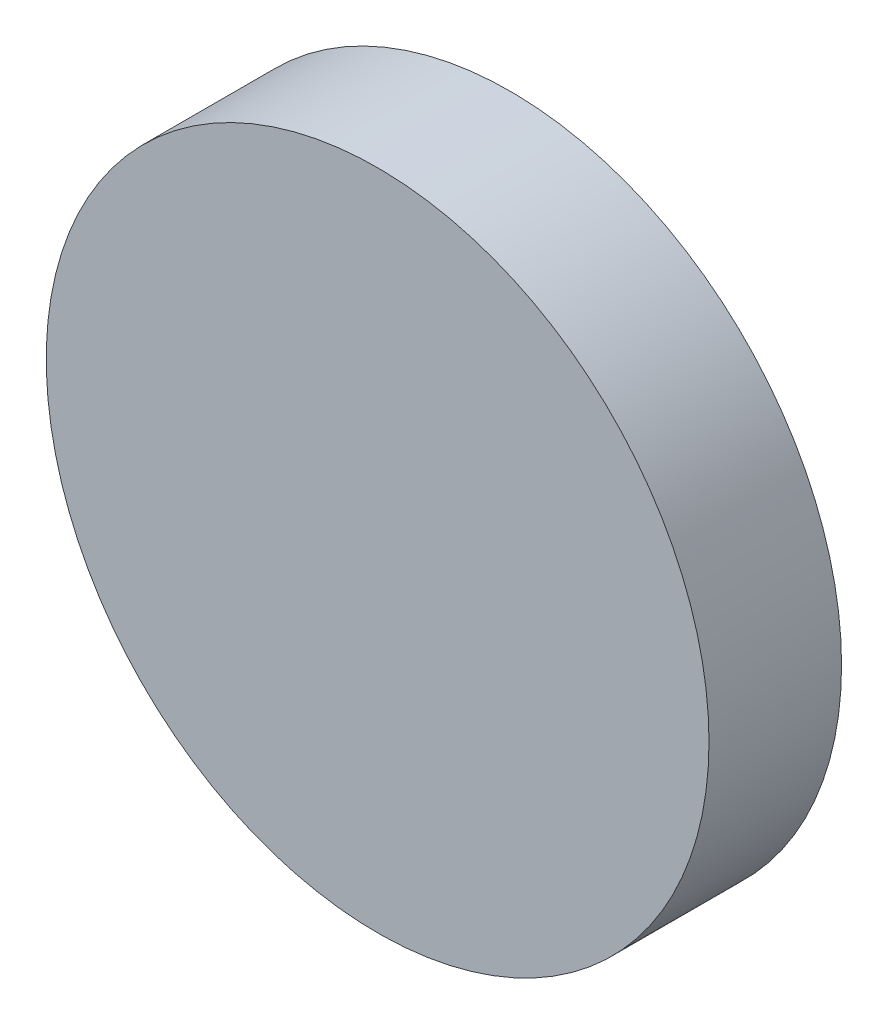
ISO-10303-21;
HEADER;
FILE_DESCRIPTION(('STEP AP214'),'2;1');
FILE_NAME('part.step','',(''),(''),'','','');
FILE_SCHEMA(('AUTOMOTIVE_DESIGN { 1 0 10303 214 1 1 1 1 }'));
ENDSEC;
DATA;
#1=APPLICATION_CONTEXT('core data for automotive mechanical design processes');
#2=APPLICATION_PROTOCOL_DEFINITION('international standard','automotive_design',2000,#1);
#3=PRODUCT_CONTEXT('',#1,'mechanical');
#4=PRODUCT('Part','Part','',(#3));
#5=PRODUCT_RELATED_PRODUCT_CATEGORY('part','',(#4));
#6=PRODUCT_DEFINITION_FORMATION('','',#4);
#7=PRODUCT_DEFINITION_CONTEXT('part definition',#1,'design');
#8=PRODUCT_DEFINITION('design','',#6,#7);
#9=PRODUCT_DEFINITION_SHAPE('','',#8);
#10=(LENGTH_UNIT() NAMED_UNIT(*) SI_UNIT(.MILLI.,.METRE.));
#11=(NAMED_UNIT(*) PLANE_ANGLE_UNIT() SI_UNIT($,.RADIAN.));
#12=(NAMED_UNIT(*) SI_UNIT($,.STERADIAN.) SOLID_ANGLE_UNIT());
#13=UNCERTAINTY_MEASURE_WITH_UNIT(LENGTH_MEASURE(1.E-05),#10,'distance_accuracy_value','');
#14=(GEOMETRIC_REPRESENTATION_CONTEXT(3) GLOBAL_UNCERTAINTY_ASSIGNED_CONTEXT((#13)) GLOBAL_UNIT_ASSIGNED_CONTEXT((#10,
#11,#12)) REPRESENTATION_CONTEXT('',''));
#15=CARTESIAN_POINT('',(0.,0.,0.));
#16=DIRECTION('',(0.,0.,1.));
#17=DIRECTION('',(1.,0.,0.));
#18=AXIS2_PLACEMENT_3D('',#15,#16,#17);
#19=CARTESIAN_POINT('',(2.5,2.5,1.));
#20=DIRECTION('',(0.,0.,-1.));
#21=DIRECTION('',(-1.,0.,0.));
#22=AXIS2_PLACEMENT_3D('',#19,#20,#21);
#23=CYLINDRICAL_SURFACE('',#22,2.5);
#24=CARTESIAN_POINT('',(2.5,2.5,1.));
#25=DIRECTION('',(0.,0.,1.));
#26=DIRECTION('',(1.,0.,0.));
#27=AXIS2_PLACEMENT_3D('',#24,#25,#26);
#28=CIRCLE('',#27,2.5);
#29=CARTESIAN_POINT('',(5.,2.5,1.));
#30=VERTEX_POINT('',#29);
#31=EDGE_CURVE('E10',#30,#30,#28,.T.);
#32=ORIENTED_EDGE('',*,*,#31,.F.);
#33=EDGE_LOOP('',(#32));
#34=FACE_BOUND('',#33,.T.);
#35=CARTESIAN_POINT('',(2.5,2.5,0.));
#36=DIRECTION('',(0.,0.,1.));
#37=DIRECTION('',(1.,0.,0.));
#38=AXIS2_PLACEMENT_3D('',#35,#36,#37);
#39=CIRCLE('',#38,2.5);
#40=CARTESIAN_POINT('',(5.,2.5,0.));
#41=VERTEX_POINT('',#40);
#42=EDGE_CURVE('E37',#41,#41,#39,.T.);
#43=ORIENTED_EDGE('',*,*,#42,.T.);
#44=EDGE_LOOP('',(#43));
#45=FACE_BOUND('',#44,.T.);
#46=ADVANCED_FACE('F40',(#34,#45),#23,.T.);
#47=CARTESIAN_POINT('',(2.5,2.5,1.));
#48=DIRECTION('',(0.,0.,1.));
#49=DIRECTION('',(1.,0.,0.));
#50=AXIS2_PLACEMENT_3D('',#47,#48,#49);
#51=PLANE('',#50);
#52=ORIENTED_EDGE('',*,*,#31,.T.);
#53=EDGE_LOOP('',(#52));
#54=FACE_BOUND('',#53,.T.);
#55=ADVANCED_FACE('F55',(#54),#51,.T.);
#56=CARTESIAN_POINT('',(2.5,2.5,0.));
#57=DIRECTION('',(0.,0.,1.));
#58=DIRECTION('',(1.,0.,0.));
#59=AXIS2_PLACEMENT_3D('',#56,#57,#58);
#60=PLANE('',#59);
#61=ORIENTED_EDGE('',*,*,#42,.F.);
#62=EDGE_LOOP('',(#61));
#63=FACE_BOUND('',#62,.T.);
#64=ADVANCED_FACE('F49',(#63),#60,.F.);
#65=CLOSED_SHELL('',(#46,#55,#64));
#66=MANIFOLD_SOLID_BREP('B2',#65);
#67=ADVANCED_BREP_SHAPE_REPRESENTATION('',(#18,#66),#14);
#68=SHAPE_DEFINITION_REPRESENTATION(#9,#67);
ENDSEC;
END-ISO-10303-21;
